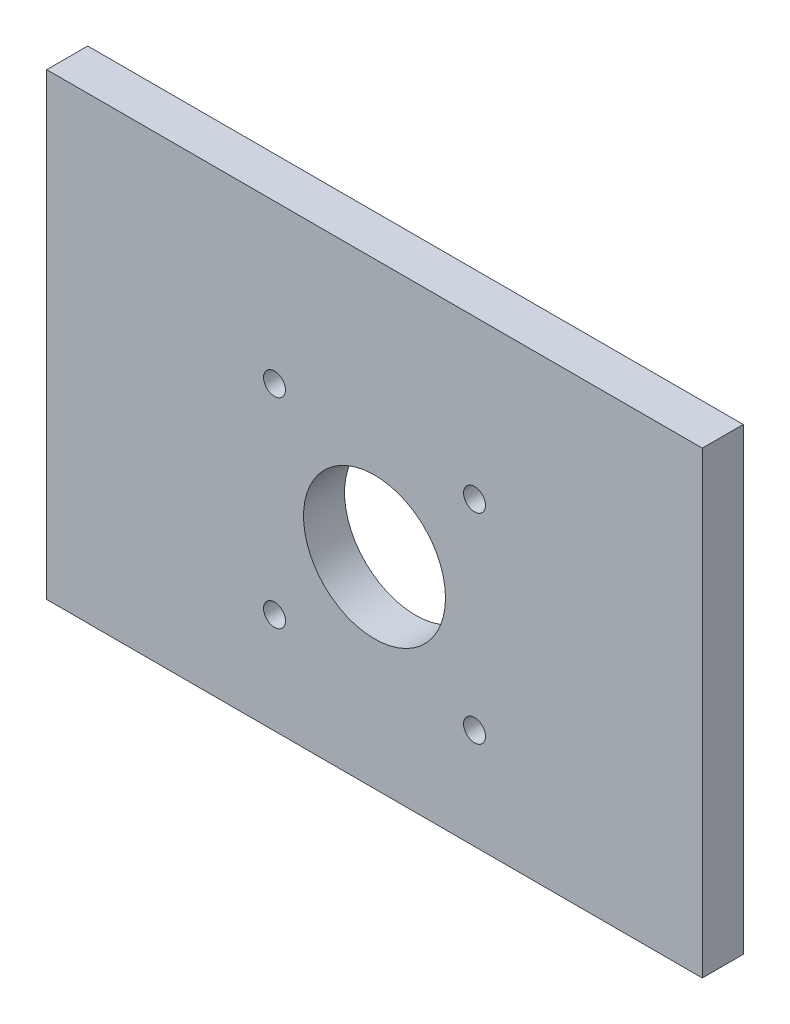
ISO-10303-21;
HEADER;
FILE_DESCRIPTION(('STEP AP214'),'2;1');
FILE_NAME('part.step','',(''),(''),'','','');
FILE_SCHEMA(('AUTOMOTIVE_DESIGN { 1 0 10303 214 1 1 1 1 }'));
ENDSEC;
DATA;
#1=APPLICATION_CONTEXT('core data for automotive mechanical design processes');
#2=APPLICATION_PROTOCOL_DEFINITION('international standard','automotive_design',2000,#1);
#3=PRODUCT_CONTEXT('',#1,'mechanical');
#4=PRODUCT('Part','Part','',(#3));
#5=PRODUCT_RELATED_PRODUCT_CATEGORY('part','',(#4));
#6=PRODUCT_DEFINITION_FORMATION('','',#4);
#7=PRODUCT_DEFINITION_CONTEXT('part definition',#1,'design');
#8=PRODUCT_DEFINITION('design','',#6,#7);
#9=PRODUCT_DEFINITION_SHAPE('','',#8);
#10=(LENGTH_UNIT() NAMED_UNIT(*) SI_UNIT(.MILLI.,.METRE.));
#11=(NAMED_UNIT(*) PLANE_ANGLE_UNIT() SI_UNIT($,.RADIAN.));
#12=(NAMED_UNIT(*) SI_UNIT($,.STERADIAN.) SOLID_ANGLE_UNIT());
#13=UNCERTAINTY_MEASURE_WITH_UNIT(LENGTH_MEASURE(1.E-05),#10,'distance_accuracy_value','');
#14=(GEOMETRIC_REPRESENTATION_CONTEXT(3) GLOBAL_UNCERTAINTY_ASSIGNED_CONTEXT((#13)) GLOBAL_UNIT_ASSIGNED_CONTEXT((#10,
#11,#12)) REPRESENTATION_CONTEXT('',''));
#15=CARTESIAN_POINT('',(0.,0.,0.));
#16=DIRECTION('',(0.,0.,1.));
#17=DIRECTION('',(1.,0.,0.));
#18=AXIS2_PLACEMENT_3D('',#15,#16,#17);
#19=CARTESIAN_POINT('',(0.,0.,6.35));
#20=DIRECTION('',(1.,0.,0.));
#21=DIRECTION('',(0.,1.,0.));
#22=AXIS2_PLACEMENT_3D('',#19,#20,#21);
#23=PLANE('',#22);
#24=DIRECTION('',(0.,-1.,0.));
#25=VECTOR('',#24,1.);
#26=CARTESIAN_POINT('',(0.,0.,0.));
#27=LINE('',#26,#25);
#28=CARTESIAN_POINT('',(0.,71.12,0.));
#29=VERTEX_POINT('',#28);
#30=CARTESIAN_POINT('',(0.,0.,0.));
#31=VERTEX_POINT('',#30);
#32=EDGE_CURVE('E96',#29,#31,#27,.T.);
#33=ORIENTED_EDGE('',*,*,#32,.T.);
#34=DIRECTION('',(0.,0.,-1.));
#35=VECTOR('',#34,1.);
#36=CARTESIAN_POINT('',(0.,0.,6.35));
#37=LINE('',#36,#35);
#38=CARTESIAN_POINT('',(0.,0.,6.35));
#39=VERTEX_POINT('',#38);
#40=EDGE_CURVE('E11',#39,#31,#37,.T.);
#41=ORIENTED_EDGE('',*,*,#40,.F.);
#42=DIRECTION('',(0.,-1.,0.));
#43=VECTOR('',#42,1.);
#44=CARTESIAN_POINT('',(0.,0.,6.35));
#45=LINE('',#44,#43);
#46=CARTESIAN_POINT('',(0.,71.12,6.35));
#47=VERTEX_POINT('',#46);
#48=EDGE_CURVE('E84',#47,#39,#45,.T.);
#49=ORIENTED_EDGE('',*,*,#48,.F.);
#50=DIRECTION('',(0.,0.,-1.));
#51=VECTOR('',#50,1.);
#52=CARTESIAN_POINT('',(0.,71.12,6.35));
#53=LINE('',#52,#51);
#54=EDGE_CURVE('E92',#47,#29,#53,.T.);
#55=ORIENTED_EDGE('',*,*,#54,.T.);
#56=EDGE_LOOP('',(#33,#41,#49,#55));
#57=FACE_BOUND('',#56,.T.);
#58=ADVANCED_FACE('F33',(#57),#23,.F.);
#59=CARTESIAN_POINT('',(0.,0.,6.35));
#60=DIRECTION('',(0.,1.,0.));
#61=DIRECTION('',(0.,0.,1.));
#62=AXIS2_PLACEMENT_3D('',#59,#60,#61);
#63=PLANE('',#62);
#64=DIRECTION('',(1.,0.,0.));
#65=VECTOR('',#64,1.);
#66=CARTESIAN_POINT('',(0.,0.,0.));
#67=LINE('',#66,#65);
#68=CARTESIAN_POINT('',(101.6,0.,0.));
#69=VERTEX_POINT('',#68);
#70=EDGE_CURVE('E88',#31,#69,#67,.T.);
#71=ORIENTED_EDGE('',*,*,#70,.T.);
#72=DIRECTION('',(0.,0.,-1.));
#73=VECTOR('',#72,1.);
#74=CARTESIAN_POINT('',(101.6,0.,6.35));
#75=LINE('',#74,#73);
#76=CARTESIAN_POINT('',(101.6,0.,6.35));
#77=VERTEX_POINT('',#76);
#78=EDGE_CURVE('E41',#77,#69,#75,.T.);
#79=ORIENTED_EDGE('',*,*,#78,.F.);
#80=DIRECTION('',(1.,0.,0.));
#81=VECTOR('',#80,1.);
#82=CARTESIAN_POINT('',(0.,0.,6.35));
#83=LINE('',#82,#81);
#84=EDGE_CURVE('E79',#39,#77,#83,.T.);
#85=ORIENTED_EDGE('',*,*,#84,.F.);
#86=ORIENTED_EDGE('',*,*,#40,.T.);
#87=EDGE_LOOP('',(#71,#79,#85,#86));
#88=FACE_BOUND('',#87,.T.);
#89=ADVANCED_FACE('F87',(#88),#63,.F.);
#90=CARTESIAN_POINT('',(101.6,0.,6.35));
#91=DIRECTION('',(-1.,0.,0.));
#92=DIRECTION('',(0.,-1.,0.));
#93=AXIS2_PLACEMENT_3D('',#90,#91,#92);
#94=PLANE('',#93);
#95=DIRECTION('',(0.,1.,0.));
#96=VECTOR('',#95,1.);
#97=CARTESIAN_POINT('',(101.6,0.,0.));
#98=LINE('',#97,#96);
#99=CARTESIAN_POINT('',(101.6,71.12,0.));
#100=VERTEX_POINT('',#99);
#101=EDGE_CURVE('E66',#69,#100,#98,.T.);
#102=ORIENTED_EDGE('',*,*,#101,.T.);
#103=DIRECTION('',(0.,0.,-1.));
#104=VECTOR('',#103,1.);
#105=CARTESIAN_POINT('',(101.6,71.12,6.35));
#106=LINE('',#105,#104);
#107=CARTESIAN_POINT('',(101.6,71.12,6.35));
#108=VERTEX_POINT('',#107);
#109=EDGE_CURVE('E89',#108,#100,#106,.T.);
#110=ORIENTED_EDGE('',*,*,#109,.F.);
#111=DIRECTION('',(0.,1.,0.));
#112=VECTOR('',#111,1.);
#113=CARTESIAN_POINT('',(101.6,0.,6.35));
#114=LINE('',#113,#112);
#115=EDGE_CURVE('E82',#77,#108,#114,.T.);
#116=ORIENTED_EDGE('',*,*,#115,.F.);
#117=ORIENTED_EDGE('',*,*,#78,.T.);
#118=EDGE_LOOP('',(#102,#110,#116,#117));
#119=FACE_BOUND('',#118,.T.);
#120=ADVANCED_FACE('F90',(#119),#94,.F.);
#121=CARTESIAN_POINT('',(0.,71.12,6.35));
#122=DIRECTION('',(0.,-1.,0.));
#123=DIRECTION('',(0.,0.,-1.));
#124=AXIS2_PLACEMENT_3D('',#121,#122,#123);
#125=PLANE('',#124);
#126=DIRECTION('',(-1.,0.,0.));
#127=VECTOR('',#126,1.);
#128=CARTESIAN_POINT('',(0.,71.12,0.));
#129=LINE('',#128,#127);
#130=EDGE_CURVE('E72',#100,#29,#129,.T.);
#131=ORIENTED_EDGE('',*,*,#130,.T.);
#132=ORIENTED_EDGE('',*,*,#54,.F.);
#133=DIRECTION('',(-1.,0.,0.));
#134=VECTOR('',#133,1.);
#135=CARTESIAN_POINT('',(0.,71.12,6.35));
#136=LINE('',#135,#134);
#137=EDGE_CURVE('E49',#108,#47,#136,.T.);
#138=ORIENTED_EDGE('',*,*,#137,.F.);
#139=ORIENTED_EDGE('',*,*,#109,.T.);
#140=EDGE_LOOP('',(#131,#132,#138,#139));
#141=FACE_BOUND('',#140,.T.);
#142=ADVANCED_FACE('F104',(#141),#125,.F.);
#143=CARTESIAN_POINT('',(0.,0.,6.35));
#144=DIRECTION('',(0.,0.,-1.));
#145=DIRECTION('',(-1.,0.,0.));
#146=AXIS2_PLACEMENT_3D('',#143,#144,#145);
#147=PLANE('',#146);
#148=CARTESIAN_POINT('',(50.8,31.115,6.35));
#149=DIRECTION('',(0.,0.,1.));
#150=DIRECTION('',(1.,0.,0.));
#151=AXIS2_PLACEMENT_3D('',#148,#149,#150);
#152=CIRCLE('',#151,11.);
#153=CARTESIAN_POINT('',(61.8,31.115,6.35));
#154=VERTEX_POINT('',#153);
#155=EDGE_CURVE('E134',#154,#154,#152,.T.);
#156=ORIENTED_EDGE('',*,*,#155,.F.);
#157=EDGE_LOOP('',(#156));
#158=FACE_BOUND('',#157,.T.);
#159=CARTESIAN_POINT('',(35.3,46.615,6.35));
#160=DIRECTION('',(0.,0.,1.));
#161=DIRECTION('',(1.,0.,0.));
#162=AXIS2_PLACEMENT_3D('',#159,#160,#161);
#163=CIRCLE('',#162,1.7);
#164=CARTESIAN_POINT('',(37.,46.615,6.35));
#165=VERTEX_POINT('',#164);
#166=EDGE_CURVE('E130',#165,#165,#163,.T.);
#167=ORIENTED_EDGE('',*,*,#166,.F.);
#168=EDGE_LOOP('',(#167));
#169=FACE_BOUND('',#168,.T.);
#170=CARTESIAN_POINT('',(66.3,15.615,6.35));
#171=DIRECTION('',(0.,0.,1.));
#172=DIRECTION('',(1.,0.,0.));
#173=AXIS2_PLACEMENT_3D('',#170,#171,#172);
#174=CIRCLE('',#173,1.69999999999999);
#175=CARTESIAN_POINT('',(68.,15.615,6.35));
#176=VERTEX_POINT('',#175);
#177=EDGE_CURVE('E124',#176,#176,#174,.T.);
#178=ORIENTED_EDGE('',*,*,#177,.F.);
#179=EDGE_LOOP('',(#178));
#180=FACE_BOUND('',#179,.T.);
#181=CARTESIAN_POINT('',(35.3,15.615,6.35));
#182=DIRECTION('',(0.,0.,1.));
#183=DIRECTION('',(1.,0.,0.));
#184=AXIS2_PLACEMENT_3D('',#181,#182,#183);
#185=CIRCLE('',#184,1.7);
#186=CARTESIAN_POINT('',(37.,15.615,6.35));
#187=VERTEX_POINT('',#186);
#188=EDGE_CURVE('E118',#187,#187,#185,.T.);
#189=ORIENTED_EDGE('',*,*,#188,.F.);
#190=EDGE_LOOP('',(#189));
#191=FACE_BOUND('',#190,.T.);
#192=CARTESIAN_POINT('',(66.3,46.615,6.35));
#193=DIRECTION('',(0.,0.,1.));
#194=DIRECTION('',(1.,0.,0.));
#195=AXIS2_PLACEMENT_3D('',#192,#193,#194);
#196=CIRCLE('',#195,1.69999999999999);
#197=CARTESIAN_POINT('',(68.,46.615,6.35));
#198=VERTEX_POINT('',#197);
#199=EDGE_CURVE('E112',#198,#198,#196,.T.);
#200=ORIENTED_EDGE('',*,*,#199,.F.);
#201=EDGE_LOOP('',(#200));
#202=FACE_BOUND('',#201,.T.);
#203=ORIENTED_EDGE('',*,*,#48,.T.);
#204=ORIENTED_EDGE('',*,*,#84,.T.);
#205=ORIENTED_EDGE('',*,*,#115,.T.);
#206=ORIENTED_EDGE('',*,*,#137,.T.);
#207=EDGE_LOOP('',(#203,#204,#205,#206));
#208=FACE_BOUND('',#207,.T.);
#209=ADVANCED_FACE('F80',(#158,#169,#180,#191,#202,#208),#147,.F.);
#210=CARTESIAN_POINT('',(0.,0.,0.));
#211=DIRECTION('',(0.,0.,-1.));
#212=DIRECTION('',(-1.,0.,0.));
#213=AXIS2_PLACEMENT_3D('',#210,#211,#212);
#214=PLANE('',#213);
#215=CARTESIAN_POINT('',(50.8,31.115,0.));
#216=DIRECTION('',(0.,0.,1.));
#217=DIRECTION('',(1.,0.,0.));
#218=AXIS2_PLACEMENT_3D('',#215,#216,#217);
#219=CIRCLE('',#218,11.);
#220=CARTESIAN_POINT('',(61.8,31.115,0.));
#221=VERTEX_POINT('',#220);
#222=EDGE_CURVE('E133',#221,#221,#219,.T.);
#223=ORIENTED_EDGE('',*,*,#222,.T.);
#224=EDGE_LOOP('',(#223));
#225=FACE_BOUND('',#224,.T.);
#226=CARTESIAN_POINT('',(35.3,46.615,0.));
#227=DIRECTION('',(0.,0.,1.));
#228=DIRECTION('',(1.,0.,0.));
#229=AXIS2_PLACEMENT_3D('',#226,#227,#228);
#230=CIRCLE('',#229,1.7);
#231=CARTESIAN_POINT('',(37.,46.615,0.));
#232=VERTEX_POINT('',#231);
#233=EDGE_CURVE('E127',#232,#232,#230,.T.);
#234=ORIENTED_EDGE('',*,*,#233,.T.);
#235=EDGE_LOOP('',(#234));
#236=FACE_BOUND('',#235,.T.);
#237=CARTESIAN_POINT('',(66.3,15.615,0.));
#238=DIRECTION('',(0.,0.,1.));
#239=DIRECTION('',(1.,0.,0.));
#240=AXIS2_PLACEMENT_3D('',#237,#238,#239);
#241=CIRCLE('',#240,1.69999999999999);
#242=CARTESIAN_POINT('',(68.,15.615,0.));
#243=VERTEX_POINT('',#242);
#244=EDGE_CURVE('E121',#243,#243,#241,.T.);
#245=ORIENTED_EDGE('',*,*,#244,.T.);
#246=EDGE_LOOP('',(#245));
#247=FACE_BOUND('',#246,.T.);
#248=CARTESIAN_POINT('',(35.3,15.615,0.));
#249=DIRECTION('',(0.,0.,1.));
#250=DIRECTION('',(1.,0.,0.));
#251=AXIS2_PLACEMENT_3D('',#248,#249,#250);
#252=CIRCLE('',#251,1.7);
#253=CARTESIAN_POINT('',(37.,15.615,0.));
#254=VERTEX_POINT('',#253);
#255=EDGE_CURVE('E115',#254,#254,#252,.T.);
#256=ORIENTED_EDGE('',*,*,#255,.T.);
#257=EDGE_LOOP('',(#256));
#258=FACE_BOUND('',#257,.T.);
#259=CARTESIAN_POINT('',(66.3,46.615,0.));
#260=DIRECTION('',(0.,0.,1.));
#261=DIRECTION('',(1.,0.,0.));
#262=AXIS2_PLACEMENT_3D('',#259,#260,#261);
#263=CIRCLE('',#262,1.69999999999999);
#264=CARTESIAN_POINT('',(68.,46.615,0.));
#265=VERTEX_POINT('',#264);
#266=EDGE_CURVE('E99',#265,#265,#263,.T.);
#267=ORIENTED_EDGE('',*,*,#266,.T.);
#268=EDGE_LOOP('',(#267));
#269=FACE_BOUND('',#268,.T.);
#270=ORIENTED_EDGE('',*,*,#32,.F.);
#271=ORIENTED_EDGE('',*,*,#130,.F.);
#272=ORIENTED_EDGE('',*,*,#101,.F.);
#273=ORIENTED_EDGE('',*,*,#70,.F.);
#274=EDGE_LOOP('',(#270,#271,#272,#273));
#275=FACE_BOUND('',#274,.T.);
#276=ADVANCED_FACE('F107',(#225,#236,#247,#258,#269,#275),#214,.T.);
#277=CARTESIAN_POINT('',(66.3,46.615,6.35));
#278=DIRECTION('',(0.,0.,1.));
#279=DIRECTION('',(1.,0.,0.));
#280=AXIS2_PLACEMENT_3D('',#277,#278,#279);
#281=CYLINDRICAL_SURFACE('',#280,1.69999999999999);
#282=ORIENTED_EDGE('',*,*,#266,.F.);
#283=EDGE_LOOP('',(#282));
#284=FACE_BOUND('',#283,.T.);
#285=ORIENTED_EDGE('',*,*,#199,.T.);
#286=EDGE_LOOP('',(#285));
#287=FACE_BOUND('',#286,.T.);
#288=ADVANCED_FACE('F160',(#284,#287),#281,.F.);
#289=CARTESIAN_POINT('',(35.3,15.615,6.35));
#290=DIRECTION('',(0.,0.,1.));
#291=DIRECTION('',(1.,0.,0.));
#292=AXIS2_PLACEMENT_3D('',#289,#290,#291);
#293=CYLINDRICAL_SURFACE('',#292,1.7);
#294=ORIENTED_EDGE('',*,*,#255,.F.);
#295=EDGE_LOOP('',(#294));
#296=FACE_BOUND('',#295,.T.);
#297=ORIENTED_EDGE('',*,*,#188,.T.);
#298=EDGE_LOOP('',(#297));
#299=FACE_BOUND('',#298,.T.);
#300=ADVANCED_FACE('F162',(#296,#299),#293,.F.);
#301=CARTESIAN_POINT('',(66.3,15.615,6.35));
#302=DIRECTION('',(0.,0.,1.));
#303=DIRECTION('',(1.,0.,0.));
#304=AXIS2_PLACEMENT_3D('',#301,#302,#303);
#305=CYLINDRICAL_SURFACE('',#304,1.69999999999999);
#306=ORIENTED_EDGE('',*,*,#244,.F.);
#307=EDGE_LOOP('',(#306));
#308=FACE_BOUND('',#307,.T.);
#309=ORIENTED_EDGE('',*,*,#177,.T.);
#310=EDGE_LOOP('',(#309));
#311=FACE_BOUND('',#310,.T.);
#312=ADVANCED_FACE('F169',(#308,#311),#305,.F.);
#313=CARTESIAN_POINT('',(35.3,46.615,6.35));
#314=DIRECTION('',(0.,0.,1.));
#315=DIRECTION('',(1.,0.,0.));
#316=AXIS2_PLACEMENT_3D('',#313,#314,#315);
#317=CYLINDRICAL_SURFACE('',#316,1.7);
#318=ORIENTED_EDGE('',*,*,#233,.F.);
#319=EDGE_LOOP('',(#318));
#320=FACE_BOUND('',#319,.T.);
#321=ORIENTED_EDGE('',*,*,#166,.T.);
#322=EDGE_LOOP('',(#321));
#323=FACE_BOUND('',#322,.T.);
#324=ADVANCED_FACE('F145',(#320,#323),#317,.F.);
#325=CARTESIAN_POINT('',(50.8,31.115,0.));
#326=DIRECTION('',(0.,0.,1.));
#327=DIRECTION('',(1.,0.,0.));
#328=AXIS2_PLACEMENT_3D('',#325,#326,#327);
#329=CYLINDRICAL_SURFACE('',#328,11.);
#330=ORIENTED_EDGE('',*,*,#222,.F.);
#331=EDGE_LOOP('',(#330));
#332=FACE_BOUND('',#331,.T.);
#333=ORIENTED_EDGE('',*,*,#155,.T.);
#334=EDGE_LOOP('',(#333));
#335=FACE_BOUND('',#334,.T.);
#336=ADVANCED_FACE('F142',(#332,#335),#329,.F.);
#337=CLOSED_SHELL('',(#58,#89,#120,#142,#209,#276,#288,#300,#312,#324,#336));
#338=MANIFOLD_SOLID_BREP('B2',#337);
#339=ADVANCED_BREP_SHAPE_REPRESENTATION('',(#18,#338),#14);
#340=SHAPE_DEFINITION_REPRESENTATION(#9,#339);
ENDSEC;
END-ISO-10303-21;
